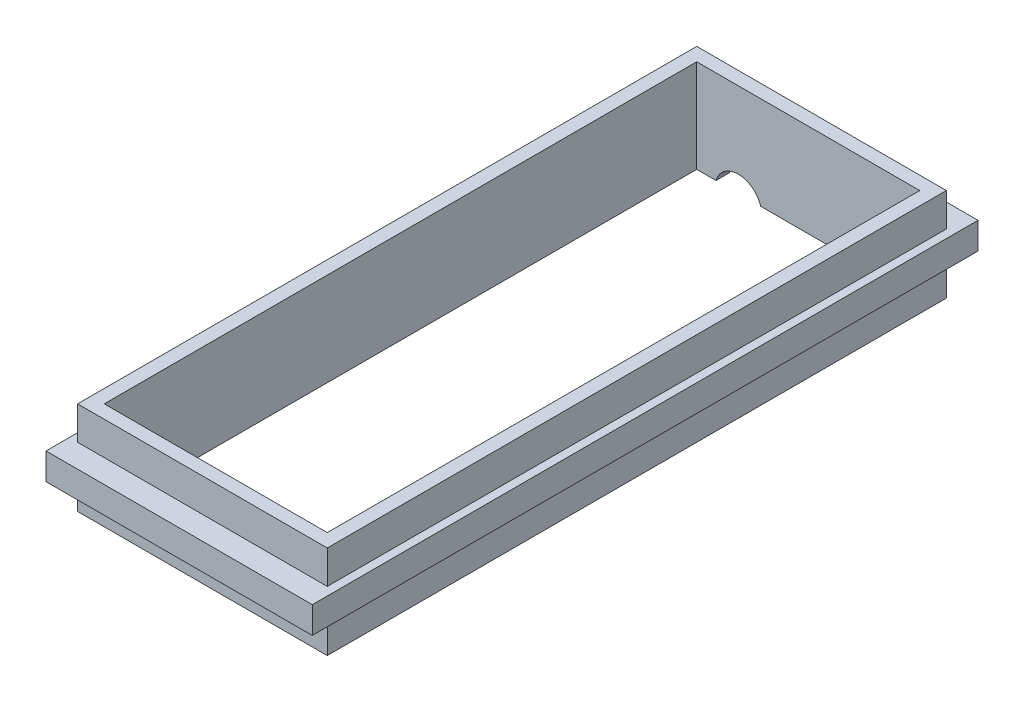
ISO-10303-21;
HEADER;
FILE_DESCRIPTION(('STEP AP214'),'2;1');
FILE_NAME('part.step','',(''),(''),'','','');
FILE_SCHEMA(('AUTOMOTIVE_DESIGN { 1 0 10303 214 1 1 1 1 }'));
ENDSEC;
DATA;
#1=APPLICATION_CONTEXT('core data for automotive mechanical design processes');
#2=APPLICATION_PROTOCOL_DEFINITION('international standard','automotive_design',2000,#1);
#3=PRODUCT_CONTEXT('',#1,'mechanical');
#4=PRODUCT('Part','Part','',(#3));
#5=PRODUCT_RELATED_PRODUCT_CATEGORY('part','',(#4));
#6=PRODUCT_DEFINITION_FORMATION('','',#4);
#7=PRODUCT_DEFINITION_CONTEXT('part definition',#1,'design');
#8=PRODUCT_DEFINITION('design','',#6,#7);
#9=PRODUCT_DEFINITION_SHAPE('','',#8);
#10=(LENGTH_UNIT() NAMED_UNIT(*) SI_UNIT(.MILLI.,.METRE.));
#11=(NAMED_UNIT(*) PLANE_ANGLE_UNIT() SI_UNIT($,.RADIAN.));
#12=(NAMED_UNIT(*) SI_UNIT($,.STERADIAN.) SOLID_ANGLE_UNIT());
#13=UNCERTAINTY_MEASURE_WITH_UNIT(LENGTH_MEASURE(1.E-05),#10,'distance_accuracy_value','');
#14=(GEOMETRIC_REPRESENTATION_CONTEXT(3) GLOBAL_UNCERTAINTY_ASSIGNED_CONTEXT((#13)) GLOBAL_UNIT_ASSIGNED_CONTEXT((#10,
#11,#12)) REPRESENTATION_CONTEXT('',''));
#15=CARTESIAN_POINT('',(0.,0.,0.));
#16=DIRECTION('',(0.,0.,1.));
#17=DIRECTION('',(1.,0.,0.));
#18=AXIS2_PLACEMENT_3D('',#15,#16,#17);
#19=CARTESIAN_POINT('',(0.,0.,0.));
#20=DIRECTION('',(0.,1.,0.));
#21=DIRECTION('',(0.,0.,1.));
#22=AXIS2_PLACEMENT_3D('',#19,#20,#21);
#23=PLANE('',#22);
#24=DIRECTION('',(-1.,0.,0.));
#25=VECTOR('',#24,1.);
#26=CARTESIAN_POINT('',(-16.75,0.,-44.5));
#27=LINE('',#26,#25);
#28=CARTESIAN_POINT('',(6.30384757729337,0.,-44.5));
#29=VERTEX_POINT('',#28);
#30=CARTESIAN_POINT('',(-7.14589803375032,0.,-44.5));
#31=VERTEX_POINT('',#30);
#32=EDGE_CURVE('E221',#29,#31,#27,.T.);
#33=ORIENTED_EDGE('',*,*,#32,.T.);
#34=DIRECTION('',(0.,0.,-1.));
#35=VECTOR('',#34,1.);
#36=CARTESIAN_POINT('',(-7.14589803375032,0.,-41.5));
#37=LINE('',#36,#35);
#38=CARTESIAN_POINT('',(-7.14589803375032,0.,-46.5));
#39=VERTEX_POINT('',#38);
#40=EDGE_CURVE('E47',#31,#39,#37,.T.);
#41=ORIENTED_EDGE('',*,*,#40,.T.);
#42=DIRECTION('',(-1.,0.,0.));
#43=VECTOR('',#42,1.);
#44=CARTESIAN_POINT('',(-18.75,0.,-46.5));
#45=LINE('',#44,#43);
#46=CARTESIAN_POINT('',(6.30384757729337,0.,-46.5));
#47=VERTEX_POINT('',#46);
#48=EDGE_CURVE('E182',#47,#39,#45,.T.);
#49=ORIENTED_EDGE('',*,*,#48,.F.);
#50=DIRECTION('',(0.,0.,-1.));
#51=VECTOR('',#50,1.);
#52=CARTESIAN_POINT('',(6.30384757729337,0.,-41.5));
#53=LINE('',#52,#51);
#54=EDGE_CURVE('E214',#47,#29,#53,.F.);
#55=ORIENTED_EDGE('',*,*,#54,.T.);
#56=EDGE_LOOP('',(#33,#41,#49,#55));
#57=FACE_BOUND('',#56,.T.);
#58=ADVANCED_FACE('F33',(#57),#23,.F.);
#59=CARTESIAN_POINT('',(0.,9.,0.));
#60=DIRECTION('',(0.,1.,0.));
#61=DIRECTION('',(0.,0.,1.));
#62=AXIS2_PLACEMENT_3D('',#59,#60,#61);
#63=PLANE('',#62);
#64=DIRECTION('',(0.,0.,1.));
#65=VECTOR('',#64,1.);
#66=CARTESIAN_POINT('',(-20.,9.,50.));
#67=LINE('',#66,#65);
#68=CARTESIAN_POINT('',(-20.,9.,-50.));
#69=VERTEX_POINT('',#68);
#70=CARTESIAN_POINT('',(-20.,9.,50.));
#71=VERTEX_POINT('',#70);
#72=EDGE_CURVE('E500',#69,#71,#67,.T.);
#73=ORIENTED_EDGE('',*,*,#72,.T.);
#74=DIRECTION('',(1.,0.,0.));
#75=VECTOR('',#74,1.);
#76=CARTESIAN_POINT('',(20.,9.,50.));
#77=LINE('',#76,#75);
#78=CARTESIAN_POINT('',(20.,9.,50.));
#79=VERTEX_POINT('',#78);
#80=EDGE_CURVE('E512',#71,#79,#77,.T.);
#81=ORIENTED_EDGE('',*,*,#80,.T.);
#82=DIRECTION('',(0.,0.,-1.));
#83=VECTOR('',#82,1.);
#84=CARTESIAN_POINT('',(20.,9.,50.));
#85=LINE('',#84,#83);
#86=CARTESIAN_POINT('',(20.,9.,-50.));
#87=VERTEX_POINT('',#86);
#88=EDGE_CURVE('E510',#79,#87,#85,.T.);
#89=ORIENTED_EDGE('',*,*,#88,.T.);
#90=DIRECTION('',(-1.,0.,0.));
#91=VECTOR('',#90,1.);
#92=CARTESIAN_POINT('',(20.,9.,-50.));
#93=LINE('',#92,#91);
#94=EDGE_CURVE('E497',#87,#69,#93,.T.);
#95=ORIENTED_EDGE('',*,*,#94,.T.);
#96=EDGE_LOOP('',(#73,#81,#89,#95));
#97=FACE_BOUND('',#96,.T.);
#98=DIRECTION('',(1.,0.,0.));
#99=VECTOR('',#98,1.);
#100=CARTESIAN_POINT('',(18.75,9.,46.5));
#101=LINE('',#100,#99);
#102=CARTESIAN_POINT('',(-18.75,9.,46.5));
#103=VERTEX_POINT('',#102);
#104=CARTESIAN_POINT('',(18.75,9.,46.5));
#105=VERTEX_POINT('',#104);
#106=EDGE_CURVE('E532',#103,#105,#101,.T.);
#107=ORIENTED_EDGE('',*,*,#106,.F.);
#108=DIRECTION('',(0.,0.,1.));
#109=VECTOR('',#108,1.);
#110=CARTESIAN_POINT('',(-18.75,9.,46.5));
#111=LINE('',#110,#109);
#112=CARTESIAN_POINT('',(-18.75,9.,-46.5));
#113=VERTEX_POINT('',#112);
#114=EDGE_CURVE('E534',#113,#103,#111,.T.);
#115=ORIENTED_EDGE('',*,*,#114,.F.);
#116=DIRECTION('',(-1.,0.,0.));
#117=VECTOR('',#116,1.);
#118=CARTESIAN_POINT('',(18.75,9.,-46.5));
#119=LINE('',#118,#117);
#120=CARTESIAN_POINT('',(18.75,9.,-46.5));
#121=VERTEX_POINT('',#120);
#122=EDGE_CURVE('E526',#121,#113,#119,.T.);
#123=ORIENTED_EDGE('',*,*,#122,.F.);
#124=DIRECTION('',(0.,0.,-1.));
#125=VECTOR('',#124,1.);
#126=CARTESIAN_POINT('',(18.75,9.,46.5));
#127=LINE('',#126,#125);
#128=EDGE_CURVE('E529',#105,#121,#127,.T.);
#129=ORIENTED_EDGE('',*,*,#128,.F.);
#130=EDGE_LOOP('',(#107,#115,#123,#129));
#131=FACE_BOUND('',#130,.T.);
#132=ADVANCED_FACE('F270',(#97,#131),#63,.T.);
#133=CARTESIAN_POINT('',(-13.8541019662497,0.,-46.5));
#134=VERTEX_POINT('',#133);
#135=CARTESIAN_POINT('',(-18.75,0.,-46.5));
#136=VERTEX_POINT('',#135);
#137=EDGE_CURVE('E178',#134,#136,#45,.T.);
#138=ORIENTED_EDGE('',*,*,#137,.F.);
#139=DIRECTION('',(0.,0.,-1.));
#140=VECTOR('',#139,1.);
#141=CARTESIAN_POINT('',(-13.8541019662497,0.,-41.5));
#142=LINE('',#141,#140);
#143=CARTESIAN_POINT('',(-13.8541019662497,0.,-44.5));
#144=VERTEX_POINT('',#143);
#145=EDGE_CURVE('E167',#134,#144,#142,.F.);
#146=ORIENTED_EDGE('',*,*,#145,.T.);
#147=CARTESIAN_POINT('',(-16.75,0.,-44.5));
#148=VERTEX_POINT('',#147);
#149=EDGE_CURVE('E226',#144,#148,#27,.T.);
#150=ORIENTED_EDGE('',*,*,#149,.T.);
#151=DIRECTION('',(0.,0.,1.));
#152=VECTOR('',#151,1.);
#153=CARTESIAN_POINT('',(-16.75,0.,-44.5));
#154=LINE('',#153,#152);
#155=CARTESIAN_POINT('',(-16.75,0.,44.5));
#156=VERTEX_POINT('',#155);
#157=EDGE_CURVE('E482',#148,#156,#154,.T.);
#158=ORIENTED_EDGE('',*,*,#157,.T.);
#159=DIRECTION('',(1.,0.,0.));
#160=VECTOR('',#159,1.);
#161=CARTESIAN_POINT('',(-16.75,0.,44.5));
#162=LINE('',#161,#160);
#163=CARTESIAN_POINT('',(16.75,0.,44.5));
#164=VERTEX_POINT('',#163);
#165=EDGE_CURVE('E479',#156,#164,#162,.T.);
#166=ORIENTED_EDGE('',*,*,#165,.T.);
#167=DIRECTION('',(0.,0.,-1.));
#168=VECTOR('',#167,1.);
#169=CARTESIAN_POINT('',(16.75,0.,-44.5));
#170=LINE('',#169,#168);
#171=CARTESIAN_POINT('',(16.75,0.,-44.5));
#172=VERTEX_POINT('',#171);
#173=EDGE_CURVE('E229',#164,#172,#170,.T.);
#174=ORIENTED_EDGE('',*,*,#173,.T.);
#175=CARTESIAN_POINT('',(16.6961524227066,0.,-44.5));
#176=VERTEX_POINT('',#175);
#177=EDGE_CURVE('E225',#172,#176,#27,.T.);
#178=ORIENTED_EDGE('',*,*,#177,.T.);
#179=DIRECTION('',(0.,0.,-1.));
#180=VECTOR('',#179,1.);
#181=CARTESIAN_POINT('',(16.6961524227066,0.,-41.5));
#182=LINE('',#181,#180);
#183=CARTESIAN_POINT('',(16.6961524227066,0.,-46.5));
#184=VERTEX_POINT('',#183);
#185=EDGE_CURVE('E55',#176,#184,#182,.T.);
#186=ORIENTED_EDGE('',*,*,#185,.T.);
#187=CARTESIAN_POINT('',(18.75,0.,-46.5));
#188=VERTEX_POINT('',#187);
#189=EDGE_CURVE('E190',#188,#184,#45,.T.);
#190=ORIENTED_EDGE('',*,*,#189,.F.);
#191=DIRECTION('',(0.,0.,-1.));
#192=VECTOR('',#191,1.);
#193=CARTESIAN_POINT('',(18.75,0.,-46.5));
#194=LINE('',#193,#192);
#195=CARTESIAN_POINT('',(18.75,0.,46.5));
#196=VERTEX_POINT('',#195);
#197=EDGE_CURVE('E188',#196,#188,#194,.T.);
#198=ORIENTED_EDGE('',*,*,#197,.F.);
#199=DIRECTION('',(1.,0.,0.));
#200=VECTOR('',#199,1.);
#201=CARTESIAN_POINT('',(-18.75,0.,46.5));
#202=LINE('',#201,#200);
#203=CARTESIAN_POINT('',(-18.75,0.,46.5));
#204=VERTEX_POINT('',#203);
#205=EDGE_CURVE('E197',#204,#196,#202,.T.);
#206=ORIENTED_EDGE('',*,*,#205,.F.);
#207=DIRECTION('',(0.,0.,1.));
#208=VECTOR('',#207,1.);
#209=CARTESIAN_POINT('',(-18.75,0.,-46.5));
#210=LINE('',#209,#208);
#211=EDGE_CURVE('E187',#136,#204,#210,.T.);
#212=ORIENTED_EDGE('',*,*,#211,.F.);
#213=EDGE_LOOP('',(#138,#146,#150,#158,#166,#174,#178,#186,#190,#198,#206,#212));
#214=FACE_BOUND('',#213,.T.);
#215=ADVANCED_FACE('F185',(#214),#23,.F.);
#216=CARTESIAN_POINT('',(18.75,5.,-46.5));
#217=DIRECTION('',(-1.,0.,0.));
#218=DIRECTION('',(0.,0.,1.));
#219=AXIS2_PLACEMENT_3D('',#216,#217,#218);
#220=PLANE('',#219);
#221=ORIENTED_EDGE('',*,*,#197,.T.);
#222=DIRECTION('',(0.,-1.,0.));
#223=VECTOR('',#222,1.);
#224=CARTESIAN_POINT('',(18.75,5.,-46.5));
#225=LINE('',#224,#223);
#226=CARTESIAN_POINT('',(18.75,5.,-46.5));
#227=VERTEX_POINT('',#226);
#228=EDGE_CURVE('E211',#227,#188,#225,.T.);
#229=ORIENTED_EDGE('',*,*,#228,.F.);
#230=DIRECTION('',(0.,0.,-1.));
#231=VECTOR('',#230,1.);
#232=CARTESIAN_POINT('',(18.75,5.,-46.5));
#233=LINE('',#232,#231);
#234=CARTESIAN_POINT('',(18.75,5.,46.5));
#235=VERTEX_POINT('',#234);
#236=EDGE_CURVE('E200',#235,#227,#233,.T.);
#237=ORIENTED_EDGE('',*,*,#236,.F.);
#238=DIRECTION('',(0.,-1.,0.));
#239=VECTOR('',#238,1.);
#240=CARTESIAN_POINT('',(18.75,5.,46.5));
#241=LINE('',#240,#239);
#242=EDGE_CURVE('E203',#235,#196,#241,.T.);
#243=ORIENTED_EDGE('',*,*,#242,.T.);
#244=EDGE_LOOP('',(#221,#229,#237,#243));
#245=FACE_BOUND('',#244,.T.);
#246=ADVANCED_FACE('F35',(#245),#220,.F.);
#247=CARTESIAN_POINT('',(-18.75,5.,-46.5));
#248=DIRECTION('',(0.,0.,1.));
#249=DIRECTION('',(1.,0.,0.));
#250=AXIS2_PLACEMENT_3D('',#247,#248,#249);
#251=PLANE('',#250);
#252=ORIENTED_EDGE('',*,*,#48,.T.);
#253=CARTESIAN_POINT('',(-10.5,-1.,-46.5));
#254=DIRECTION('',(0.,0.,-1.));
#255=DIRECTION('',(-1.,0.,0.));
#256=AXIS2_PLACEMENT_3D('',#253,#254,#255);
#257=CIRCLE('',#256,3.5);
#258=EDGE_CURVE('E170',#134,#39,#257,.T.);
#259=ORIENTED_EDGE('',*,*,#258,.F.);
#260=ORIENTED_EDGE('',*,*,#137,.T.);
#261=DIRECTION('',(0.,-1.,0.));
#262=VECTOR('',#261,1.);
#263=CARTESIAN_POINT('',(-18.75,5.,-46.5));
#264=LINE('',#263,#262);
#265=CARTESIAN_POINT('',(-18.75,5.,-46.5));
#266=VERTEX_POINT('',#265);
#267=EDGE_CURVE('E209',#266,#136,#264,.T.);
#268=ORIENTED_EDGE('',*,*,#267,.F.);
#269=DIRECTION('',(-1.,0.,0.));
#270=VECTOR('',#269,1.);
#271=CARTESIAN_POINT('',(-18.75,5.,-46.5));
#272=LINE('',#271,#270);
#273=EDGE_CURVE('E243',#227,#266,#272,.T.);
#274=ORIENTED_EDGE('',*,*,#273,.F.);
#275=ORIENTED_EDGE('',*,*,#228,.T.);
#276=ORIENTED_EDGE('',*,*,#189,.T.);
#277=CARTESIAN_POINT('',(11.5,-3.,-46.5));
#278=DIRECTION('',(0.,0.,-1.));
#279=DIRECTION('',(-1.,0.,0.));
#280=AXIS2_PLACEMENT_3D('',#277,#278,#279);
#281=CIRCLE('',#280,6.);
#282=EDGE_CURVE('E222',#47,#184,#281,.T.);
#283=ORIENTED_EDGE('',*,*,#282,.F.);
#284=EDGE_LOOP('',(#252,#259,#260,#268,#274,#275,#276,#283));
#285=FACE_BOUND('',#284,.T.);
#286=ADVANCED_FACE('F177',(#285),#251,.F.);
#287=CARTESIAN_POINT('',(-18.75,5.,-46.5));
#288=DIRECTION('',(1.,0.,0.));
#289=DIRECTION('',(0.,0.,-1.));
#290=AXIS2_PLACEMENT_3D('',#287,#288,#289);
#291=PLANE('',#290);
#292=ORIENTED_EDGE('',*,*,#211,.T.);
#293=DIRECTION('',(0.,-1.,0.));
#294=VECTOR('',#293,1.);
#295=CARTESIAN_POINT('',(-18.75,5.,46.5));
#296=LINE('',#295,#294);
#297=CARTESIAN_POINT('',(-18.75,5.,46.5));
#298=VERTEX_POINT('',#297);
#299=EDGE_CURVE('E206',#298,#204,#296,.T.);
#300=ORIENTED_EDGE('',*,*,#299,.F.);
#301=DIRECTION('',(0.,0.,1.));
#302=VECTOR('',#301,1.);
#303=CARTESIAN_POINT('',(-18.75,5.,-46.5));
#304=LINE('',#303,#302);
#305=EDGE_CURVE('E246',#266,#298,#304,.T.);
#306=ORIENTED_EDGE('',*,*,#305,.F.);
#307=ORIENTED_EDGE('',*,*,#267,.T.);
#308=EDGE_LOOP('',(#292,#300,#306,#307));
#309=FACE_BOUND('',#308,.T.);
#310=ADVANCED_FACE('F260',(#309),#291,.F.);
#311=CARTESIAN_POINT('',(-18.75,5.,46.5));
#312=DIRECTION('',(0.,0.,-1.));
#313=DIRECTION('',(-1.,0.,0.));
#314=AXIS2_PLACEMENT_3D('',#311,#312,#313);
#315=PLANE('',#314);
#316=ORIENTED_EDGE('',*,*,#205,.T.);
#317=ORIENTED_EDGE('',*,*,#242,.F.);
#318=DIRECTION('',(1.,0.,0.));
#319=VECTOR('',#318,1.);
#320=CARTESIAN_POINT('',(-18.75,5.,46.5));
#321=LINE('',#320,#319);
#322=EDGE_CURVE('E207',#298,#235,#321,.T.);
#323=ORIENTED_EDGE('',*,*,#322,.F.);
#324=ORIENTED_EDGE('',*,*,#299,.T.);
#325=EDGE_LOOP('',(#316,#317,#323,#324));
#326=FACE_BOUND('',#325,.T.);
#327=ADVANCED_FACE('F256',(#326),#315,.F.);
#328=CARTESIAN_POINT('',(-16.75,5.,-44.5));
#329=DIRECTION('',(1.,0.,0.));
#330=DIRECTION('',(0.,0.,-1.));
#331=AXIS2_PLACEMENT_3D('',#328,#329,#330);
#332=PLANE('',#331);
#333=ORIENTED_EDGE('',*,*,#157,.F.);
#334=DIRECTION('',(0.,-1.,0.));
#335=VECTOR('',#334,1.);
#336=CARTESIAN_POINT('',(-16.75,5.,-44.5));
#337=LINE('',#336,#335);
#338=CARTESIAN_POINT('',(-16.75,14.,-44.5));
#339=VERTEX_POINT('',#338);
#340=EDGE_CURVE('E228',#339,#148,#337,.T.);
#341=ORIENTED_EDGE('',*,*,#340,.F.);
#342=DIRECTION('',(0.,0.,1.));
#343=VECTOR('',#342,1.);
#344=CARTESIAN_POINT('',(-16.75,14.,44.5));
#345=LINE('',#344,#343);
#346=CARTESIAN_POINT('',(-16.75,14.,44.5));
#347=VERTEX_POINT('',#346);
#348=EDGE_CURVE('E551',#339,#347,#345,.T.);
#349=ORIENTED_EDGE('',*,*,#348,.T.);
#350=DIRECTION('',(0.,-1.,0.));
#351=VECTOR('',#350,1.);
#352=CARTESIAN_POINT('',(-16.75,5.,44.5));
#353=LINE('',#352,#351);
#354=EDGE_CURVE('E192',#347,#156,#353,.T.);
#355=ORIENTED_EDGE('',*,*,#354,.T.);
#356=EDGE_LOOP('',(#333,#341,#349,#355));
#357=FACE_BOUND('',#356,.T.);
#358=ADVANCED_FACE('F267',(#357),#332,.T.);
#359=CARTESIAN_POINT('',(-16.75,5.,44.5));
#360=DIRECTION('',(0.,0.,-1.));
#361=DIRECTION('',(-1.,0.,0.));
#362=AXIS2_PLACEMENT_3D('',#359,#360,#361);
#363=PLANE('',#362);
#364=ORIENTED_EDGE('',*,*,#165,.F.);
#365=ORIENTED_EDGE('',*,*,#354,.F.);
#366=DIRECTION('',(1.,0.,0.));
#367=VECTOR('',#366,1.);
#368=CARTESIAN_POINT('',(16.75,14.,44.5));
#369=LINE('',#368,#367);
#370=CARTESIAN_POINT('',(16.75,14.,44.5));
#371=VERTEX_POINT('',#370);
#372=EDGE_CURVE('E549',#347,#371,#369,.T.);
#373=ORIENTED_EDGE('',*,*,#372,.T.);
#374=DIRECTION('',(0.,-1.,0.));
#375=VECTOR('',#374,1.);
#376=CARTESIAN_POINT('',(16.75,5.,44.5));
#377=LINE('',#376,#375);
#378=EDGE_CURVE('E237',#371,#164,#377,.T.);
#379=ORIENTED_EDGE('',*,*,#378,.T.);
#380=EDGE_LOOP('',(#364,#365,#373,#379));
#381=FACE_BOUND('',#380,.T.);
#382=ADVANCED_FACE('F419',(#381),#363,.T.);
#383=CARTESIAN_POINT('',(16.75,5.,-44.5));
#384=DIRECTION('',(-1.,0.,0.));
#385=DIRECTION('',(0.,0.,1.));
#386=AXIS2_PLACEMENT_3D('',#383,#384,#385);
#387=PLANE('',#386);
#388=ORIENTED_EDGE('',*,*,#173,.F.);
#389=ORIENTED_EDGE('',*,*,#378,.F.);
#390=DIRECTION('',(0.,0.,-1.));
#391=VECTOR('',#390,1.);
#392=CARTESIAN_POINT('',(16.75,14.,44.5));
#393=LINE('',#392,#391);
#394=CARTESIAN_POINT('',(16.75,14.,-44.5));
#395=VERTEX_POINT('',#394);
#396=EDGE_CURVE('E547',#371,#395,#393,.T.);
#397=ORIENTED_EDGE('',*,*,#396,.T.);
#398=DIRECTION('',(0.,-1.,0.));
#399=VECTOR('',#398,1.);
#400=CARTESIAN_POINT('',(16.75,5.,-44.5));
#401=LINE('',#400,#399);
#402=EDGE_CURVE('E235',#395,#172,#401,.T.);
#403=ORIENTED_EDGE('',*,*,#402,.T.);
#404=EDGE_LOOP('',(#388,#389,#397,#403));
#405=FACE_BOUND('',#404,.T.);
#406=ADVANCED_FACE('F300',(#405),#387,.T.);
#407=CARTESIAN_POINT('',(-16.75,5.,-44.5));
#408=DIRECTION('',(0.,0.,1.));
#409=DIRECTION('',(1.,0.,0.));
#410=AXIS2_PLACEMENT_3D('',#407,#408,#409);
#411=PLANE('',#410);
#412=CARTESIAN_POINT('',(-10.5,-1.,-44.5));
#413=DIRECTION('',(0.,0.,1.));
#414=DIRECTION('',(1.,0.,0.));
#415=AXIS2_PLACEMENT_3D('',#412,#413,#414);
#416=CIRCLE('',#415,3.5);
#417=EDGE_CURVE('E11',#31,#144,#416,.T.);
#418=ORIENTED_EDGE('',*,*,#417,.F.);
#419=ORIENTED_EDGE('',*,*,#32,.F.);
#420=CARTESIAN_POINT('',(11.5,-3.,-44.5));
#421=DIRECTION('',(0.,0.,1.));
#422=DIRECTION('',(1.,0.,0.));
#423=AXIS2_PLACEMENT_3D('',#420,#421,#422);
#424=CIRCLE('',#423,6.);
#425=EDGE_CURVE('E41',#176,#29,#424,.T.);
#426=ORIENTED_EDGE('',*,*,#425,.F.);
#427=ORIENTED_EDGE('',*,*,#177,.F.);
#428=ORIENTED_EDGE('',*,*,#402,.F.);
#429=DIRECTION('',(-1.,0.,0.));
#430=VECTOR('',#429,1.);
#431=CARTESIAN_POINT('',(16.75,14.,-44.5));
#432=LINE('',#431,#430);
#433=EDGE_CURVE('E537',#395,#339,#432,.T.);
#434=ORIENTED_EDGE('',*,*,#433,.T.);
#435=ORIENTED_EDGE('',*,*,#340,.T.);
#436=ORIENTED_EDGE('',*,*,#149,.F.);
#437=EDGE_LOOP('',(#418,#419,#426,#427,#428,#434,#435,#436));
#438=FACE_BOUND('',#437,.T.);
#439=ADVANCED_FACE('F224',(#438),#411,.T.);
#440=CARTESIAN_POINT('',(0.,5.,0.));
#441=DIRECTION('',(0.,1.,0.));
#442=DIRECTION('',(0.,0.,1.));
#443=AXIS2_PLACEMENT_3D('',#440,#441,#442);
#444=PLANE('',#443);
#445=DIRECTION('',(0.,0.,1.));
#446=VECTOR('',#445,1.);
#447=CARTESIAN_POINT('',(-20.,5.,50.));
#448=LINE('',#447,#446);
#449=CARTESIAN_POINT('',(-20.,5.,-50.));
#450=VERTEX_POINT('',#449);
#451=CARTESIAN_POINT('',(-20.,5.,50.));
#452=VERTEX_POINT('',#451);
#453=EDGE_CURVE('E505',#450,#452,#448,.T.);
#454=ORIENTED_EDGE('',*,*,#453,.F.);
#455=DIRECTION('',(-1.,0.,0.));
#456=VECTOR('',#455,1.);
#457=CARTESIAN_POINT('',(20.,5.,-50.));
#458=LINE('',#457,#456);
#459=CARTESIAN_POINT('',(20.,5.,-50.));
#460=VERTEX_POINT('',#459);
#461=EDGE_CURVE('E498',#460,#450,#458,.T.);
#462=ORIENTED_EDGE('',*,*,#461,.F.);
#463=DIRECTION('',(0.,0.,-1.));
#464=VECTOR('',#463,1.);
#465=CARTESIAN_POINT('',(20.,5.,50.));
#466=LINE('',#465,#464);
#467=CARTESIAN_POINT('',(20.,5.,50.));
#468=VERTEX_POINT('',#467);
#469=EDGE_CURVE('E501',#468,#460,#466,.T.);
#470=ORIENTED_EDGE('',*,*,#469,.F.);
#471=DIRECTION('',(1.,0.,0.));
#472=VECTOR('',#471,1.);
#473=CARTESIAN_POINT('',(20.,5.,50.));
#474=LINE('',#473,#472);
#475=EDGE_CURVE('E503',#452,#468,#474,.T.);
#476=ORIENTED_EDGE('',*,*,#475,.F.);
#477=EDGE_LOOP('',(#454,#462,#470,#476));
#478=FACE_BOUND('',#477,.T.);
#479=ORIENTED_EDGE('',*,*,#322,.T.);
#480=ORIENTED_EDGE('',*,*,#236,.T.);
#481=ORIENTED_EDGE('',*,*,#273,.T.);
#482=ORIENTED_EDGE('',*,*,#305,.T.);
#483=EDGE_LOOP('',(#479,#480,#481,#482));
#484=FACE_BOUND('',#483,.T.);
#485=ADVANCED_FACE('F252',(#478,#484),#444,.F.);
#486=CARTESIAN_POINT('',(-20.,9.,50.));
#487=DIRECTION('',(1.,0.,0.));
#488=DIRECTION('',(0.,0.,-1.));
#489=AXIS2_PLACEMENT_3D('',#486,#487,#488);
#490=PLANE('',#489);
#491=ORIENTED_EDGE('',*,*,#453,.T.);
#492=DIRECTION('',(0.,-1.,0.));
#493=VECTOR('',#492,1.);
#494=CARTESIAN_POINT('',(-20.,9.,50.));
#495=LINE('',#494,#493);
#496=EDGE_CURVE('E483',#71,#452,#495,.T.);
#497=ORIENTED_EDGE('',*,*,#496,.F.);
#498=ORIENTED_EDGE('',*,*,#72,.F.);
#499=DIRECTION('',(0.,-1.,0.));
#500=VECTOR('',#499,1.);
#501=CARTESIAN_POINT('',(-20.,9.,-50.));
#502=LINE('',#501,#500);
#503=EDGE_CURVE('E494',#69,#450,#502,.T.);
#504=ORIENTED_EDGE('',*,*,#503,.T.);
#505=EDGE_LOOP('',(#491,#497,#498,#504));
#506=FACE_BOUND('',#505,.T.);
#507=ADVANCED_FACE('F386',(#506),#490,.F.);
#508=CARTESIAN_POINT('',(20.,9.,50.));
#509=DIRECTION('',(0.,0.,-1.));
#510=DIRECTION('',(-1.,0.,0.));
#511=AXIS2_PLACEMENT_3D('',#508,#509,#510);
#512=PLANE('',#511);
#513=ORIENTED_EDGE('',*,*,#475,.T.);
#514=DIRECTION('',(0.,-1.,0.));
#515=VECTOR('',#514,1.);
#516=CARTESIAN_POINT('',(20.,9.,50.));
#517=LINE('',#516,#515);
#518=EDGE_CURVE('E488',#79,#468,#517,.T.);
#519=ORIENTED_EDGE('',*,*,#518,.F.);
#520=ORIENTED_EDGE('',*,*,#80,.F.);
#521=ORIENTED_EDGE('',*,*,#496,.T.);
#522=EDGE_LOOP('',(#513,#519,#520,#521));
#523=FACE_BOUND('',#522,.T.);
#524=ADVANCED_FACE('F378',(#523),#512,.F.);
#525=CARTESIAN_POINT('',(20.,9.,50.));
#526=DIRECTION('',(-1.,0.,0.));
#527=DIRECTION('',(0.,0.,1.));
#528=AXIS2_PLACEMENT_3D('',#525,#526,#527);
#529=PLANE('',#528);
#530=ORIENTED_EDGE('',*,*,#469,.T.);
#531=DIRECTION('',(0.,-1.,0.));
#532=VECTOR('',#531,1.);
#533=CARTESIAN_POINT('',(20.,9.,-50.));
#534=LINE('',#533,#532);
#535=EDGE_CURVE('E491',#87,#460,#534,.T.);
#536=ORIENTED_EDGE('',*,*,#535,.F.);
#537=ORIENTED_EDGE('',*,*,#88,.F.);
#538=ORIENTED_EDGE('',*,*,#518,.T.);
#539=EDGE_LOOP('',(#530,#536,#537,#538));
#540=FACE_BOUND('',#539,.T.);
#541=ADVANCED_FACE('F369',(#540),#529,.F.);
#542=CARTESIAN_POINT('',(20.,9.,-50.));
#543=DIRECTION('',(0.,0.,1.));
#544=DIRECTION('',(1.,0.,0.));
#545=AXIS2_PLACEMENT_3D('',#542,#543,#544);
#546=PLANE('',#545);
#547=ORIENTED_EDGE('',*,*,#461,.T.);
#548=ORIENTED_EDGE('',*,*,#503,.F.);
#549=ORIENTED_EDGE('',*,*,#94,.F.);
#550=ORIENTED_EDGE('',*,*,#535,.T.);
#551=EDGE_LOOP('',(#547,#548,#549,#550));
#552=FACE_BOUND('',#551,.T.);
#553=ADVANCED_FACE('F361',(#552),#546,.F.);
#554=CARTESIAN_POINT('',(0.,14.,0.));
#555=DIRECTION('',(0.,1.,0.));
#556=DIRECTION('',(0.,0.,1.));
#557=AXIS2_PLACEMENT_3D('',#554,#555,#556);
#558=PLANE('',#557);
#559=DIRECTION('',(0.,0.,1.));
#560=VECTOR('',#559,1.);
#561=CARTESIAN_POINT('',(-18.75,14.,46.5));
#562=LINE('',#561,#560);
#563=CARTESIAN_POINT('',(-18.75,14.,-46.5));
#564=VERTEX_POINT('',#563);
#565=CARTESIAN_POINT('',(-18.75,14.,46.5));
#566=VERTEX_POINT('',#565);
#567=EDGE_CURVE('E528',#564,#566,#562,.T.);
#568=ORIENTED_EDGE('',*,*,#567,.T.);
#569=DIRECTION('',(1.,0.,0.));
#570=VECTOR('',#569,1.);
#571=CARTESIAN_POINT('',(18.75,14.,46.5));
#572=LINE('',#571,#570);
#573=CARTESIAN_POINT('',(18.75,14.,46.5));
#574=VERTEX_POINT('',#573);
#575=EDGE_CURVE('E541',#566,#574,#572,.T.);
#576=ORIENTED_EDGE('',*,*,#575,.T.);
#577=DIRECTION('',(0.,0.,-1.));
#578=VECTOR('',#577,1.);
#579=CARTESIAN_POINT('',(18.75,14.,46.5));
#580=LINE('',#579,#578);
#581=CARTESIAN_POINT('',(18.75,14.,-46.5));
#582=VERTEX_POINT('',#581);
#583=EDGE_CURVE('E539',#574,#582,#580,.T.);
#584=ORIENTED_EDGE('',*,*,#583,.T.);
#585=DIRECTION('',(-1.,0.,0.));
#586=VECTOR('',#585,1.);
#587=CARTESIAN_POINT('',(18.75,14.,-46.5));
#588=LINE('',#587,#586);
#589=EDGE_CURVE('E525',#582,#564,#588,.T.);
#590=ORIENTED_EDGE('',*,*,#589,.T.);
#591=EDGE_LOOP('',(#568,#576,#584,#590));
#592=FACE_BOUND('',#591,.T.);
#593=ORIENTED_EDGE('',*,*,#372,.F.);
#594=ORIENTED_EDGE('',*,*,#348,.F.);
#595=ORIENTED_EDGE('',*,*,#433,.F.);
#596=ORIENTED_EDGE('',*,*,#396,.F.);
#597=EDGE_LOOP('',(#593,#594,#595,#596));
#598=FACE_BOUND('',#597,.T.);
#599=ADVANCED_FACE('F353',(#592,#598),#558,.T.);
#600=CARTESIAN_POINT('',(-18.75,14.,46.5));
#601=DIRECTION('',(1.,0.,0.));
#602=DIRECTION('',(0.,0.,-1.));
#603=AXIS2_PLACEMENT_3D('',#600,#601,#602);
#604=PLANE('',#603);
#605=ORIENTED_EDGE('',*,*,#114,.T.);
#606=DIRECTION('',(0.,-1.,0.));
#607=VECTOR('',#606,1.);
#608=CARTESIAN_POINT('',(-18.75,14.,46.5));
#609=LINE('',#608,#607);
#610=EDGE_CURVE('E508',#566,#103,#609,.T.);
#611=ORIENTED_EDGE('',*,*,#610,.F.);
#612=ORIENTED_EDGE('',*,*,#567,.F.);
#613=DIRECTION('',(0.,-1.,0.));
#614=VECTOR('',#613,1.);
#615=CARTESIAN_POINT('',(-18.75,14.,-46.5));
#616=LINE('',#615,#614);
#617=EDGE_CURVE('E522',#564,#113,#616,.T.);
#618=ORIENTED_EDGE('',*,*,#617,.T.);
#619=EDGE_LOOP('',(#605,#611,#612,#618));
#620=FACE_BOUND('',#619,.T.);
#621=ADVANCED_FACE('F345',(#620),#604,.F.);
#622=CARTESIAN_POINT('',(18.75,14.,46.5));
#623=DIRECTION('',(0.,0.,-1.));
#624=DIRECTION('',(-1.,0.,0.));
#625=AXIS2_PLACEMENT_3D('',#622,#623,#624);
#626=PLANE('',#625);
#627=ORIENTED_EDGE('',*,*,#106,.T.);
#628=DIRECTION('',(0.,-1.,0.));
#629=VECTOR('',#628,1.);
#630=CARTESIAN_POINT('',(18.75,14.,46.5));
#631=LINE('',#630,#629);
#632=EDGE_CURVE('E517',#574,#105,#631,.T.);
#633=ORIENTED_EDGE('',*,*,#632,.F.);
#634=ORIENTED_EDGE('',*,*,#575,.F.);
#635=ORIENTED_EDGE('',*,*,#610,.T.);
#636=EDGE_LOOP('',(#627,#633,#634,#635));
#637=FACE_BOUND('',#636,.T.);
#638=ADVANCED_FACE('F337',(#637),#626,.F.);
#639=CARTESIAN_POINT('',(18.75,14.,46.5));
#640=DIRECTION('',(-1.,0.,0.));
#641=DIRECTION('',(0.,0.,1.));
#642=AXIS2_PLACEMENT_3D('',#639,#640,#641);
#643=PLANE('',#642);
#644=ORIENTED_EDGE('',*,*,#128,.T.);
#645=DIRECTION('',(0.,-1.,0.));
#646=VECTOR('',#645,1.);
#647=CARTESIAN_POINT('',(18.75,14.,-46.5));
#648=LINE('',#647,#646);
#649=EDGE_CURVE('E520',#582,#121,#648,.T.);
#650=ORIENTED_EDGE('',*,*,#649,.F.);
#651=ORIENTED_EDGE('',*,*,#583,.F.);
#652=ORIENTED_EDGE('',*,*,#632,.T.);
#653=EDGE_LOOP('',(#644,#650,#651,#652));
#654=FACE_BOUND('',#653,.T.);
#655=ADVANCED_FACE('F329',(#654),#643,.F.);
#656=CARTESIAN_POINT('',(18.75,14.,-46.5));
#657=DIRECTION('',(0.,0.,1.));
#658=DIRECTION('',(1.,0.,0.));
#659=AXIS2_PLACEMENT_3D('',#656,#657,#658);
#660=PLANE('',#659);
#661=ORIENTED_EDGE('',*,*,#122,.T.);
#662=ORIENTED_EDGE('',*,*,#617,.F.);
#663=ORIENTED_EDGE('',*,*,#589,.F.);
#664=ORIENTED_EDGE('',*,*,#649,.T.);
#665=EDGE_LOOP('',(#661,#662,#663,#664));
#666=FACE_BOUND('',#665,.T.);
#667=ADVANCED_FACE('F322',(#666),#660,.F.);
#668=CARTESIAN_POINT('',(11.5,-3.,-41.5));
#669=DIRECTION('',(0.,0.,-1.));
#670=DIRECTION('',(-1.,0.,0.));
#671=AXIS2_PLACEMENT_3D('',#668,#669,#670);
#672=CYLINDRICAL_SURFACE('',#671,6.);
#673=ORIENTED_EDGE('',*,*,#425,.T.);
#674=ORIENTED_EDGE('',*,*,#54,.F.);
#675=ORIENTED_EDGE('',*,*,#282,.T.);
#676=ORIENTED_EDGE('',*,*,#185,.F.);
#677=EDGE_LOOP('',(#673,#674,#675,#676));
#678=FACE_BOUND('',#677,.T.);
#679=ADVANCED_FACE('F213',(#678),#672,.F.);
#680=CARTESIAN_POINT('',(-10.5,-1.,-41.5));
#681=DIRECTION('',(0.,0.,-1.));
#682=DIRECTION('',(-1.,0.,0.));
#683=AXIS2_PLACEMENT_3D('',#680,#681,#682);
#684=CYLINDRICAL_SURFACE('',#683,3.5);
#685=ORIENTED_EDGE('',*,*,#417,.T.);
#686=ORIENTED_EDGE('',*,*,#145,.F.);
#687=ORIENTED_EDGE('',*,*,#258,.T.);
#688=ORIENTED_EDGE('',*,*,#40,.F.);
#689=EDGE_LOOP('',(#685,#686,#687,#688));
#690=FACE_BOUND('',#689,.T.);
#691=ADVANCED_FACE('F169',(#690),#684,.F.);
#692=CLOSED_SHELL('',(#58,#132,#215,#246,#286,#310,#327,#358,#382,#406,#439,#485,#507,#524,#541,
#553,#599,#621,#638,#655,#667,#679,#691));
#693=MANIFOLD_SOLID_BREP('B2',#692);
#694=ADVANCED_BREP_SHAPE_REPRESENTATION('',(#18,#693),#14);
#695=SHAPE_DEFINITION_REPRESENTATION(#9,#694);
ENDSEC;
END-ISO-10303-21;
